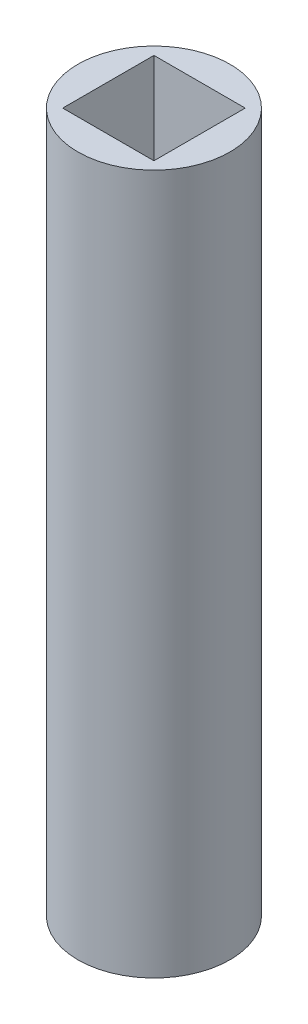
ISO-10303-21;
HEADER;
FILE_DESCRIPTION(('STEP AP214'),'2;1');
FILE_NAME('part.step','',(''),(''),'','','');
FILE_SCHEMA(('AUTOMOTIVE_DESIGN { 1 0 10303 214 1 1 1 1 }'));
ENDSEC;
DATA;
#1=APPLICATION_CONTEXT('core data for automotive mechanical design processes');
#2=APPLICATION_PROTOCOL_DEFINITION('international standard','automotive_design',2000,#1);
#3=PRODUCT_CONTEXT('',#1,'mechanical');
#4=PRODUCT('Part','Part','',(#3));
#5=PRODUCT_RELATED_PRODUCT_CATEGORY('part','',(#4));
#6=PRODUCT_DEFINITION_FORMATION('','',#4);
#7=PRODUCT_DEFINITION_CONTEXT('part definition',#1,'design');
#8=PRODUCT_DEFINITION('design','',#6,#7);
#9=PRODUCT_DEFINITION_SHAPE('','',#8);
#10=(LENGTH_UNIT() NAMED_UNIT(*) SI_UNIT(.MILLI.,.METRE.));
#11=(NAMED_UNIT(*) PLANE_ANGLE_UNIT() SI_UNIT($,.RADIAN.));
#12=(NAMED_UNIT(*) SI_UNIT($,.STERADIAN.) SOLID_ANGLE_UNIT());
#13=UNCERTAINTY_MEASURE_WITH_UNIT(LENGTH_MEASURE(1.E-05),#10,'distance_accuracy_value','');
#14=(GEOMETRIC_REPRESENTATION_CONTEXT(3) GLOBAL_UNCERTAINTY_ASSIGNED_CONTEXT((#13)) GLOBAL_UNIT_ASSIGNED_CONTEXT((#10,
#11,#12)) REPRESENTATION_CONTEXT('',''));
#15=CARTESIAN_POINT('',(0.,0.,0.));
#16=DIRECTION('',(0.,0.,1.));
#17=DIRECTION('',(1.,0.,0.));
#18=AXIS2_PLACEMENT_3D('',#15,#16,#17);
#19=CARTESIAN_POINT('',(0.,146.05,0.));
#20=DIRECTION('',(0.,-1.,0.));
#21=DIRECTION('',(0.,0.,-1.));
#22=AXIS2_PLACEMENT_3D('',#19,#20,#21);
#23=CYLINDRICAL_SURFACE('',#22,15.875);
#24=CARTESIAN_POINT('',(0.,146.05,0.));
#25=DIRECTION('',(0.,1.,0.));
#26=DIRECTION('',(0.,0.,1.));
#27=AXIS2_PLACEMENT_3D('',#24,#25,#26);
#28=CIRCLE('',#27,15.875);
#29=CARTESIAN_POINT('',(0.,146.05,15.875));
#30=VERTEX_POINT('',#29);
#31=EDGE_CURVE('E125',#30,#30,#28,.T.);
#32=ORIENTED_EDGE('',*,*,#31,.F.);
#33=EDGE_LOOP('',(#32));
#34=FACE_BOUND('',#33,.T.);
#35=CARTESIAN_POINT('',(0.,0.,0.));
#36=DIRECTION('',(0.,1.,0.));
#37=DIRECTION('',(0.,0.,1.));
#38=AXIS2_PLACEMENT_3D('',#35,#36,#37);
#39=CIRCLE('',#38,15.875);
#40=CARTESIAN_POINT('',(0.,0.,15.875));
#41=VERTEX_POINT('',#40);
#42=EDGE_CURVE('E116',#41,#41,#39,.T.);
#43=ORIENTED_EDGE('',*,*,#42,.T.);
#44=EDGE_LOOP('',(#43));
#45=FACE_BOUND('',#44,.T.);
#46=ADVANCED_FACE('F50',(#34,#45),#23,.T.);
#47=CARTESIAN_POINT('',(0.,146.05,0.));
#48=DIRECTION('',(0.,1.,0.));
#49=DIRECTION('',(0.,0.,1.));
#50=AXIS2_PLACEMENT_3D('',#47,#48,#49);
#51=PLANE('',#50);
#52=DIRECTION('',(0.,0.,1.));
#53=VECTOR('',#52,1.);
#54=CARTESIAN_POINT('',(-9.525,146.05,9.52500000000001));
#55=LINE('',#54,#53);
#56=CARTESIAN_POINT('',(-9.525,146.05,-9.525));
#57=VERTEX_POINT('',#56);
#58=CARTESIAN_POINT('',(-9.525,146.05,9.52500000000001));
#59=VERTEX_POINT('',#58);
#60=EDGE_CURVE('E64',#57,#59,#55,.T.);
#61=ORIENTED_EDGE('',*,*,#60,.F.);
#62=DIRECTION('',(-1.,0.,0.));
#63=VECTOR('',#62,1.);
#64=CARTESIAN_POINT('',(9.525,146.05,-9.525));
#65=LINE('',#64,#63);
#66=CARTESIAN_POINT('',(9.525,146.05,-9.525));
#67=VERTEX_POINT('',#66);
#68=EDGE_CURVE('E108',#67,#57,#65,.T.);
#69=ORIENTED_EDGE('',*,*,#68,.F.);
#70=DIRECTION('',(0.,0.,-1.));
#71=VECTOR('',#70,1.);
#72=CARTESIAN_POINT('',(9.525,146.05,9.525));
#73=LINE('',#72,#71);
#74=CARTESIAN_POINT('',(9.525,146.05,9.525));
#75=VERTEX_POINT('',#74);
#76=EDGE_CURVE('E93',#75,#67,#73,.T.);
#77=ORIENTED_EDGE('',*,*,#76,.F.);
#78=DIRECTION('',(1.,0.,0.));
#79=VECTOR('',#78,1.);
#80=CARTESIAN_POINT('',(9.525,146.05,9.525));
#81=LINE('',#80,#79);
#82=EDGE_CURVE('E101',#59,#75,#81,.T.);
#83=ORIENTED_EDGE('',*,*,#82,.F.);
#84=EDGE_LOOP('',(#61,#69,#77,#83));
#85=FACE_BOUND('',#84,.T.);
#86=ORIENTED_EDGE('',*,*,#31,.T.);
#87=EDGE_LOOP('',(#86));
#88=FACE_BOUND('',#87,.T.);
#89=ADVANCED_FACE('F106',(#85,#88),#51,.T.);
#90=CARTESIAN_POINT('',(0.,0.,0.));
#91=DIRECTION('',(0.,1.,0.));
#92=DIRECTION('',(0.,0.,1.));
#93=AXIS2_PLACEMENT_3D('',#90,#91,#92);
#94=PLANE('',#93);
#95=DIRECTION('',(-1.,0.,0.));
#96=VECTOR('',#95,1.);
#97=CARTESIAN_POINT('',(0.,0.,-9.525));
#98=LINE('',#97,#96);
#99=CARTESIAN_POINT('',(9.525,0.,-9.525));
#100=VERTEX_POINT('',#99);
#101=CARTESIAN_POINT('',(-9.525,0.,-9.525));
#102=VERTEX_POINT('',#101);
#103=EDGE_CURVE('E54',#100,#102,#98,.T.);
#104=ORIENTED_EDGE('',*,*,#103,.T.);
#105=DIRECTION('',(0.,0.,1.));
#106=VECTOR('',#105,1.);
#107=CARTESIAN_POINT('',(-9.525,0.,0.));
#108=LINE('',#107,#106);
#109=CARTESIAN_POINT('',(-9.525,0.,9.52500000000001));
#110=VERTEX_POINT('',#109);
#111=EDGE_CURVE('E11',#102,#110,#108,.T.);
#112=ORIENTED_EDGE('',*,*,#111,.T.);
#113=DIRECTION('',(1.,0.,0.));
#114=VECTOR('',#113,1.);
#115=CARTESIAN_POINT('',(0.,0.,9.525));
#116=LINE('',#115,#114);
#117=CARTESIAN_POINT('',(9.525,0.,9.525));
#118=VERTEX_POINT('',#117);
#119=EDGE_CURVE('E126',#110,#118,#116,.T.);
#120=ORIENTED_EDGE('',*,*,#119,.T.);
#121=DIRECTION('',(0.,0.,-1.));
#122=VECTOR('',#121,1.);
#123=CARTESIAN_POINT('',(9.525,0.,0.));
#124=LINE('',#123,#122);
#125=EDGE_CURVE('E94',#118,#100,#124,.T.);
#126=ORIENTED_EDGE('',*,*,#125,.T.);
#127=EDGE_LOOP('',(#104,#112,#120,#126));
#128=FACE_BOUND('',#127,.T.);
#129=ORIENTED_EDGE('',*,*,#42,.F.);
#130=EDGE_LOOP('',(#129));
#131=FACE_BOUND('',#130,.T.);
#132=ADVANCED_FACE('F137',(#128,#131),#94,.F.);
#133=CARTESIAN_POINT('',(-9.525,-26.6700000000001,9.52500000000001));
#134=DIRECTION('',(-1.,0.,0.));
#135=DIRECTION('',(0.,0.,1.));
#136=AXIS2_PLACEMENT_3D('',#133,#134,#135);
#137=PLANE('',#136);
#138=DIRECTION('',(0.,1.,0.));
#139=VECTOR('',#138,1.);
#140=CARTESIAN_POINT('',(-9.525,-26.6700000000001,-9.525));
#141=LINE('',#140,#139);
#142=EDGE_CURVE('E117',#102,#57,#141,.T.);
#143=ORIENTED_EDGE('',*,*,#142,.T.);
#144=ORIENTED_EDGE('',*,*,#60,.T.);
#145=DIRECTION('',(0.,1.,0.));
#146=VECTOR('',#145,1.);
#147=CARTESIAN_POINT('',(-9.525,-26.6700000000001,9.52500000000001));
#148=LINE('',#147,#146);
#149=EDGE_CURVE('E98',#110,#59,#148,.T.);
#150=ORIENTED_EDGE('',*,*,#149,.F.);
#151=ORIENTED_EDGE('',*,*,#111,.F.);
#152=EDGE_LOOP('',(#143,#144,#150,#151));
#153=FACE_BOUND('',#152,.T.);
#154=ADVANCED_FACE('F141',(#153),#137,.F.);
#155=CARTESIAN_POINT('',(9.525,-26.6700000000001,-9.525));
#156=DIRECTION('',(0.,0.,-1.));
#157=DIRECTION('',(-1.,0.,0.));
#158=AXIS2_PLACEMENT_3D('',#155,#156,#157);
#159=PLANE('',#158);
#160=DIRECTION('',(0.,1.,0.));
#161=VECTOR('',#160,1.);
#162=CARTESIAN_POINT('',(9.525,-26.6700000000001,-9.525));
#163=LINE('',#162,#161);
#164=EDGE_CURVE('E100',#100,#67,#163,.T.);
#165=ORIENTED_EDGE('',*,*,#164,.T.);
#166=ORIENTED_EDGE('',*,*,#68,.T.);
#167=ORIENTED_EDGE('',*,*,#142,.F.);
#168=ORIENTED_EDGE('',*,*,#103,.F.);
#169=EDGE_LOOP('',(#165,#166,#167,#168));
#170=FACE_BOUND('',#169,.T.);
#171=ADVANCED_FACE('F142',(#170),#159,.F.);
#172=CARTESIAN_POINT('',(9.525,-26.6700000000001,9.525));
#173=DIRECTION('',(1.,0.,0.));
#174=DIRECTION('',(0.,0.,-1.));
#175=AXIS2_PLACEMENT_3D('',#172,#173,#174);
#176=PLANE('',#175);
#177=DIRECTION('',(0.,1.,0.));
#178=VECTOR('',#177,1.);
#179=CARTESIAN_POINT('',(9.525,-26.6700000000001,9.525));
#180=LINE('',#179,#178);
#181=EDGE_CURVE('E66',#118,#75,#180,.T.);
#182=ORIENTED_EDGE('',*,*,#181,.T.);
#183=ORIENTED_EDGE('',*,*,#76,.T.);
#184=ORIENTED_EDGE('',*,*,#164,.F.);
#185=ORIENTED_EDGE('',*,*,#125,.F.);
#186=EDGE_LOOP('',(#182,#183,#184,#185));
#187=FACE_BOUND('',#186,.T.);
#188=ADVANCED_FACE('F86',(#187),#176,.F.);
#189=CARTESIAN_POINT('',(9.525,-26.6700000000001,9.525));
#190=DIRECTION('',(0.,0.,1.));
#191=DIRECTION('',(1.,0.,0.));
#192=AXIS2_PLACEMENT_3D('',#189,#190,#191);
#193=PLANE('',#192);
#194=ORIENTED_EDGE('',*,*,#149,.T.);
#195=ORIENTED_EDGE('',*,*,#82,.T.);
#196=ORIENTED_EDGE('',*,*,#181,.F.);
#197=ORIENTED_EDGE('',*,*,#119,.F.);
#198=EDGE_LOOP('',(#194,#195,#196,#197));
#199=FACE_BOUND('',#198,.T.);
#200=ADVANCED_FACE('F105',(#199),#193,.F.);
#201=CLOSED_SHELL('',(#46,#89,#132,#154,#171,#188,#200));
#202=MANIFOLD_SOLID_BREP('B2',#201);
#203=ADVANCED_BREP_SHAPE_REPRESENTATION('',(#18,#202),#14);
#204=SHAPE_DEFINITION_REPRESENTATION(#9,#203);
ENDSEC;
END-ISO-10303-21;
